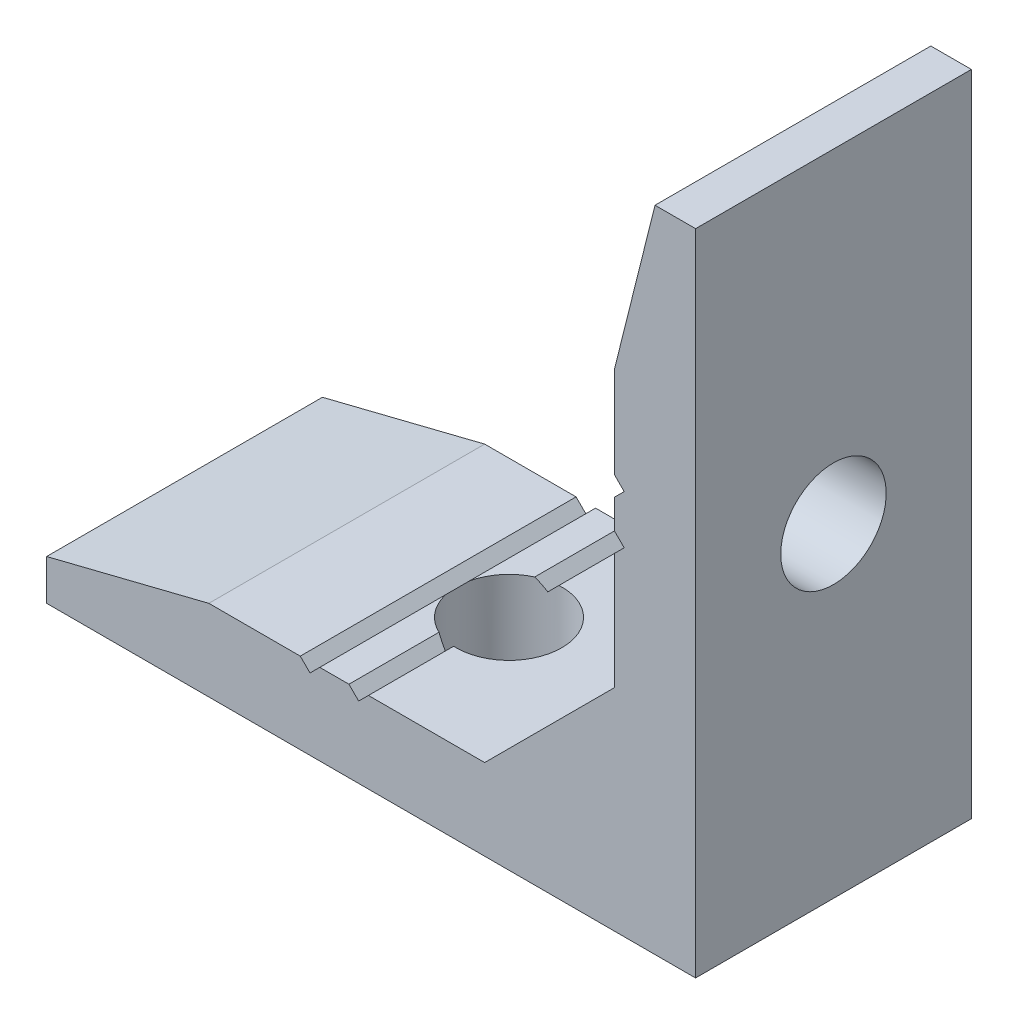
ISO-10303-21;
HEADER;
FILE_DESCRIPTION(('STEP AP214'),'2;1');
FILE_NAME('part.step','',(''),(''),'','','');
FILE_SCHEMA(('AUTOMOTIVE_DESIGN { 1 0 10303 214 1 1 1 1 }'));
ENDSEC;
DATA;
#1=APPLICATION_CONTEXT('core data for automotive mechanical design processes');
#2=APPLICATION_PROTOCOL_DEFINITION('international standard','automotive_design',2000,#1);
#3=PRODUCT_CONTEXT('',#1,'mechanical');
#4=PRODUCT('Part','Part','',(#3));
#5=PRODUCT_RELATED_PRODUCT_CATEGORY('part','',(#4));
#6=PRODUCT_DEFINITION_FORMATION('','',#4);
#7=PRODUCT_DEFINITION_CONTEXT('part definition',#1,'design');
#8=PRODUCT_DEFINITION('design','',#6,#7);
#9=PRODUCT_DEFINITION_SHAPE('','',#8);
#10=(LENGTH_UNIT() NAMED_UNIT(*) SI_UNIT(.MILLI.,.METRE.));
#11=(NAMED_UNIT(*) PLANE_ANGLE_UNIT() SI_UNIT($,.RADIAN.));
#12=(NAMED_UNIT(*) SI_UNIT($,.STERADIAN.) SOLID_ANGLE_UNIT());
#13=UNCERTAINTY_MEASURE_WITH_UNIT(LENGTH_MEASURE(1.E-05),#10,'distance_accuracy_value','');
#14=(GEOMETRIC_REPRESENTATION_CONTEXT(3) GLOBAL_UNCERTAINTY_ASSIGNED_CONTEXT((#13)) GLOBAL_UNIT_ASSIGNED_CONTEXT((#10,
#11,#12)) REPRESENTATION_CONTEXT('',''));
#15=CARTESIAN_POINT('',(0.,0.,0.));
#16=DIRECTION('',(0.,0.,1.));
#17=DIRECTION('',(1.,0.,0.));
#18=AXIS2_PLACEMENT_3D('',#15,#16,#17);
#19=CARTESIAN_POINT('',(34.9999999999998,21.3649508334714,8.5));
#20=DIRECTION('',(1.,-1.27213054904832E-13,0.));
#21=DIRECTION('',(1.27213054904832E-13,1.,0.));
#22=AXIS2_PLACEMENT_3D('',#19,#20,#21);
#23=PLANE('',#22);
#24=DIRECTION('',(0.,0.,-1.));
#25=VECTOR('',#24,1.);
#26=CARTESIAN_POINT('',(35.,23.1649508334733,8.5));
#27=LINE('',#26,#25);
#28=CARTESIAN_POINT('',(35.,23.1649508334733,8.5));
#29=VERTEX_POINT('',#28);
#30=CARTESIAN_POINT('',(35.,23.1649508334733,0.738638085733853));
#31=VERTEX_POINT('',#30);
#32=EDGE_CURVE('E257',#29,#31,#27,.T.);
#33=ORIENTED_EDGE('',*,*,#32,.T.);
#34=CARTESIAN_POINT('',(35.,20.,0.));
#35=DIRECTION('',(-1.,0.,0.));
#36=DIRECTION('',(0.,0.,1.));
#37=AXIS2_PLACEMENT_3D('',#34,#35,#36);
#38=CIRCLE('',#37,3.25);
#39=CARTESIAN_POINT('',(35.,21.3649508334712,2.94947609283518));
#40=VERTEX_POINT('',#39);
#41=EDGE_CURVE('E507',#40,#31,#38,.T.);
#42=ORIENTED_EDGE('',*,*,#41,.F.);
#43=DIRECTION('',(0.,0.,-1.));
#44=VECTOR('',#43,1.);
#45=CARTESIAN_POINT('',(34.9999999999998,21.3649508334714,8.5));
#46=LINE('',#45,#44);
#47=CARTESIAN_POINT('',(34.9999999999998,21.3649508334714,8.5));
#48=VERTEX_POINT('',#47);
#49=EDGE_CURVE('E253',#48,#40,#46,.T.);
#50=ORIENTED_EDGE('',*,*,#49,.F.);
#51=DIRECTION('',(-1.27213054904832E-13,-1.,0.));
#52=VECTOR('',#51,1.);
#53=CARTESIAN_POINT('',(34.9999999999998,21.3649508334714,8.5));
#54=LINE('',#53,#52);
#55=EDGE_CURVE('E406',#29,#48,#54,.T.);
#56=ORIENTED_EDGE('',*,*,#55,.F.);
#57=EDGE_LOOP('',(#33,#42,#50,#56));
#58=FACE_BOUND('',#57,.T.);
#59=ADVANCED_FACE('F35',(#58),#23,.F.);
#60=CARTESIAN_POINT('',(35.5999999999993,20.7649508334723,8.5));
#61=DIRECTION('',(0.707106781186345,0.70710678118675,0.));
#62=DIRECTION('',(-0.70710678118675,0.707106781186345,0.));
#63=AXIS2_PLACEMENT_3D('',#60,#61,#62);
#64=PLANE('',#63);
#65=ORIENTED_EDGE('',*,*,#49,.T.);
#66=CARTESIAN_POINT('',(36.364950833472,20.,0.));
#67=DIRECTION('',(0.707106781186345,0.70710678118675,0.));
#68=DIRECTION('',(-0.70710678118675,0.707106781186345,0.));
#69=AXIS2_PLACEMENT_3D('',#66,#67,#68);
#70=ELLIPSE('',#69,4.59619407771387,3.25);
#71=CARTESIAN_POINT('',(35.5999999999993,20.7649508334723,3.15869438571857));
#72=VERTEX_POINT('',#71);
#73=EDGE_CURVE('E238',#40,#72,#70,.T.);
#74=ORIENTED_EDGE('',*,*,#73,.T.);
#75=DIRECTION('',(0.,0.,-1.));
#76=VECTOR('',#75,1.);
#77=CARTESIAN_POINT('',(35.5999999999993,20.7649508334723,8.5));
#78=LINE('',#77,#76);
#79=CARTESIAN_POINT('',(35.5999999999993,20.7649508334723,8.5));
#80=VERTEX_POINT('',#79);
#81=EDGE_CURVE('E237',#80,#72,#78,.T.);
#82=ORIENTED_EDGE('',*,*,#81,.F.);
#83=DIRECTION('',(0.70710678118675,-0.707106781186345,0.));
#84=VECTOR('',#83,1.);
#85=CARTESIAN_POINT('',(35.5999999999993,20.7649508334723,8.5));
#86=LINE('',#85,#84);
#87=EDGE_CURVE('E408',#48,#80,#86,.T.);
#88=ORIENTED_EDGE('',*,*,#87,.F.);
#89=EDGE_LOOP('',(#65,#74,#82,#88));
#90=FACE_BOUND('',#89,.T.);
#91=ADVANCED_FACE('F509',(#90),#64,.F.);
#92=CARTESIAN_POINT('',(35.5999999999993,20.7649508334723,8.5));
#93=DIRECTION('',(0.707106781186615,-0.70710678118648,0.));
#94=DIRECTION('',(0.70710678118648,0.707106781186615,0.));
#95=AXIS2_PLACEMENT_3D('',#92,#93,#94);
#96=PLANE('',#95);
#97=DIRECTION('',(0.,0.,-1.));
#98=VECTOR('',#97,1.);
#99=CARTESIAN_POINT('',(35.,20.164950833473,8.5));
#100=LINE('',#99,#98);
#101=CARTESIAN_POINT('',(35.,20.164950833473,-3.24581133501881));
#102=VERTEX_POINT('',#101);
#103=CARTESIAN_POINT('',(35.,20.164950833473,-8.5));
#104=VERTEX_POINT('',#103);
#105=EDGE_CURVE('E245',#102,#104,#100,.T.);
#106=ORIENTED_EDGE('',*,*,#105,.F.);
#107=CARTESIAN_POINT('',(34.8350491665271,20.,0.));
#108=DIRECTION('',(0.707106781186615,-0.70710678118648,0.));
#109=DIRECTION('',(-0.70710678118648,-0.707106781186615,0.));
#110=AXIS2_PLACEMENT_3D('',#107,#108,#109);
#111=ELLIPSE('',#110,4.59619407771212,3.25);
#112=CARTESIAN_POINT('',(35.5999999999993,20.7649508334723,-3.15869438571857));
#113=VERTEX_POINT('',#112);
#114=EDGE_CURVE('E50',#102,#113,#111,.T.);
#115=ORIENTED_EDGE('',*,*,#114,.T.);
#116=CARTESIAN_POINT('',(35.5999999999993,20.7649508334723,-8.5));
#117=VERTEX_POINT('',#116);
#118=EDGE_CURVE('E244',#113,#117,#78,.T.);
#119=ORIENTED_EDGE('',*,*,#118,.T.);
#120=DIRECTION('',(-0.70710678118648,-0.707106781186615,0.));
#121=VECTOR('',#120,1.);
#122=CARTESIAN_POINT('',(35.5999999999993,20.7649508334723,-8.5));
#123=LINE('',#122,#121);
#124=EDGE_CURVE('E339',#117,#104,#123,.T.);
#125=ORIENTED_EDGE('',*,*,#124,.T.);
#126=EDGE_LOOP('',(#106,#115,#119,#125));
#127=FACE_BOUND('',#126,.T.);
#128=ADVANCED_FACE('F452',(#127),#96,.F.);
#129=CARTESIAN_POINT('',(19.2350491665275,4.39999999999998,8.5));
#130=DIRECTION('',(0.707106781186479,-0.707106781186616,0.));
#131=DIRECTION('',(0.707106781186616,0.707106781186479,0.));
#132=AXIS2_PLACEMENT_3D('',#129,#130,#131);
#133=PLANE('',#132);
#134=DIRECTION('',(0.,0.,-1.));
#135=VECTOR('',#134,1.);
#136=CARTESIAN_POINT('',(19.8350491665276,5.,8.5));
#137=LINE('',#136,#135);
#138=CARTESIAN_POINT('',(19.8350491665276,5.,8.5));
#139=VERTEX_POINT('',#138);
#140=CARTESIAN_POINT('',(19.8350491665276,5.,3.24581133501884));
#141=VERTEX_POINT('',#140);
#142=EDGE_CURVE('E312',#139,#141,#137,.T.);
#143=ORIENTED_EDGE('',*,*,#142,.T.);
#144=CARTESIAN_POINT('',(20.,5.16495083347237,0.));
#145=DIRECTION('',(0.707106781186479,-0.707106781186616,0.));
#146=DIRECTION('',(0.707106781186616,0.707106781186479,0.));
#147=AXIS2_PLACEMENT_3D('',#144,#145,#146);
#148=ELLIPSE('',#147,4.59619407771211,3.25);
#149=CARTESIAN_POINT('',(19.2350491665275,4.39999999999998,3.15869438571851));
#150=VERTEX_POINT('',#149);
#151=EDGE_CURVE('E392',#141,#150,#148,.T.);
#152=ORIENTED_EDGE('',*,*,#151,.T.);
#153=DIRECTION('',(0.,0.,-1.));
#154=VECTOR('',#153,1.);
#155=CARTESIAN_POINT('',(19.2350491665275,4.39999999999998,8.5));
#156=LINE('',#155,#154);
#157=CARTESIAN_POINT('',(19.2350491665275,4.39999999999998,8.5));
#158=VERTEX_POINT('',#157);
#159=EDGE_CURVE('E308',#158,#150,#156,.T.);
#160=ORIENTED_EDGE('',*,*,#159,.F.);
#161=DIRECTION('',(-0.707106781186616,-0.707106781186479,0.));
#162=VECTOR('',#161,1.);
#163=CARTESIAN_POINT('',(19.2350491665275,4.39999999999998,8.5));
#164=LINE('',#163,#162);
#165=EDGE_CURVE('E416',#139,#158,#164,.T.);
#166=ORIENTED_EDGE('',*,*,#165,.F.);
#167=EDGE_LOOP('',(#143,#152,#160,#166));
#168=FACE_BOUND('',#167,.T.);
#169=ADVANCED_FACE('F519',(#168),#133,.F.);
#170=CARTESIAN_POINT('',(19.2350491665275,4.39999999999998,8.5));
#171=DIRECTION('',(-0.707106781186481,-0.707106781186614,0.));
#172=DIRECTION('',(0.707106781186614,-0.707106781186481,0.));
#173=AXIS2_PLACEMENT_3D('',#170,#171,#172);
#174=PLANE('',#173);
#175=DIRECTION('',(0.,0.,-1.));
#176=VECTOR('',#175,1.);
#177=CARTESIAN_POINT('',(18.6350491665274,5.,8.5));
#178=LINE('',#177,#176);
#179=CARTESIAN_POINT('',(18.6350491665274,5.,-2.9494760928345));
#180=VERTEX_POINT('',#179);
#181=CARTESIAN_POINT('',(18.6350491665274,5.,-8.5));
#182=VERTEX_POINT('',#181);
#183=EDGE_CURVE('E298',#180,#182,#178,.T.);
#184=ORIENTED_EDGE('',*,*,#183,.F.);
#185=CARTESIAN_POINT('',(20.,3.63504916652758,0.));
#186=DIRECTION('',(-0.707106781186481,-0.707106781186614,0.));
#187=DIRECTION('',(-0.707106781186614,0.707106781186481,0.));
#188=AXIS2_PLACEMENT_3D('',#185,#186,#187);
#189=ELLIPSE('',#188,4.59619407771213,3.25);
#190=CARTESIAN_POINT('',(19.2350491665275,4.39999999999998,-3.15869438571851));
#191=VERTEX_POINT('',#190);
#192=EDGE_CURVE('E575',#180,#191,#189,.T.);
#193=ORIENTED_EDGE('',*,*,#192,.T.);
#194=CARTESIAN_POINT('',(19.2350491665275,4.39999999999998,-8.5));
#195=VERTEX_POINT('',#194);
#196=EDGE_CURVE('E307',#191,#195,#156,.T.);
#197=ORIENTED_EDGE('',*,*,#196,.T.);
#198=DIRECTION('',(-0.707106781186614,0.707106781186481,0.));
#199=VECTOR('',#198,1.);
#200=CARTESIAN_POINT('',(19.2350491665275,4.39999999999998,-8.5));
#201=LINE('',#200,#199);
#202=EDGE_CURVE('E345',#195,#182,#201,.T.);
#203=ORIENTED_EDGE('',*,*,#202,.T.);
#204=EDGE_LOOP('',(#184,#193,#197,#203));
#205=FACE_BOUND('',#204,.T.);
#206=ADVANCED_FACE('F711',(#205),#174,.F.);
#207=CARTESIAN_POINT('',(16.8350491665274,5.,8.5));
#208=DIRECTION('',(0.,-1.,0.));
#209=DIRECTION('',(0.,0.,-1.));
#210=AXIS2_PLACEMENT_3D('',#207,#208,#209);
#211=PLANE('',#210);
#212=CARTESIAN_POINT('',(18.6350491665274,5.,8.5));
#213=VERTEX_POINT('',#212);
#214=CARTESIAN_POINT('',(18.6350491665274,5.,2.9494760928345));
#215=VERTEX_POINT('',#214);
#216=EDGE_CURVE('E304',#213,#215,#178,.T.);
#217=ORIENTED_EDGE('',*,*,#216,.T.);
#218=CARTESIAN_POINT('',(20.,5.,0.));
#219=DIRECTION('',(0.,1.,0.));
#220=DIRECTION('',(0.,0.,1.));
#221=AXIS2_PLACEMENT_3D('',#218,#219,#220);
#222=CIRCLE('',#221,3.25);
#223=CARTESIAN_POINT('',(16.8350491665274,5.,0.738638085736784));
#224=VERTEX_POINT('',#223);
#225=EDGE_CURVE('E529',#224,#215,#222,.T.);
#226=ORIENTED_EDGE('',*,*,#225,.F.);
#227=DIRECTION('',(0.,0.,-1.));
#228=VECTOR('',#227,1.);
#229=CARTESIAN_POINT('',(16.8350491665274,5.,8.5));
#230=LINE('',#229,#228);
#231=CARTESIAN_POINT('',(16.8350491665274,5.,8.5));
#232=VERTEX_POINT('',#231);
#233=EDGE_CURVE('E288',#232,#224,#230,.T.);
#234=ORIENTED_EDGE('',*,*,#233,.F.);
#235=DIRECTION('',(-1.,0.,0.));
#236=VECTOR('',#235,1.);
#237=CARTESIAN_POINT('',(16.8350491665274,5.,8.5));
#238=LINE('',#237,#236);
#239=EDGE_CURVE('E420',#213,#232,#238,.T.);
#240=ORIENTED_EDGE('',*,*,#239,.F.);
#241=EDGE_LOOP('',(#217,#226,#234,#240));
#242=FACE_BOUND('',#241,.T.);
#243=ADVANCED_FACE('F528',(#242),#211,.F.);
#244=CARTESIAN_POINT('',(0.,2.5,8.5));
#245=DIRECTION('',(1.,0.,0.));
#246=DIRECTION('',(0.,0.,-1.));
#247=AXIS2_PLACEMENT_3D('',#244,#245,#246);
#248=PLANE('',#247);
#249=DIRECTION('',(0.,-1.,0.));
#250=VECTOR('',#249,1.);
#251=CARTESIAN_POINT('',(0.,2.5,-8.5));
#252=LINE('',#251,#250);
#253=CARTESIAN_POINT('',(0.,2.5,-8.5));
#254=VERTEX_POINT('',#253);
#255=CARTESIAN_POINT('',(0.,0.,-8.5));
#256=VERTEX_POINT('',#255);
#257=EDGE_CURVE('E377',#254,#256,#252,.T.);
#258=ORIENTED_EDGE('',*,*,#257,.T.);
#259=DIRECTION('',(0.,0.,-1.));
#260=VECTOR('',#259,1.);
#261=CARTESIAN_POINT('',(0.,0.,8.5));
#262=LINE('',#261,#260);
#263=CARTESIAN_POINT('',(0.,0.,8.5));
#264=VERTEX_POINT('',#263);
#265=EDGE_CURVE('E278',#264,#256,#262,.T.);
#266=ORIENTED_EDGE('',*,*,#265,.F.);
#267=DIRECTION('',(0.,-1.,0.));
#268=VECTOR('',#267,1.);
#269=CARTESIAN_POINT('',(0.,2.5,8.5));
#270=LINE('',#269,#268);
#271=CARTESIAN_POINT('',(0.,2.5,8.5));
#272=VERTEX_POINT('',#271);
#273=EDGE_CURVE('E357',#272,#264,#270,.T.);
#274=ORIENTED_EDGE('',*,*,#273,.F.);
#275=DIRECTION('',(0.,0.,-1.));
#276=VECTOR('',#275,1.);
#277=CARTESIAN_POINT('',(0.,2.5,8.5));
#278=LINE('',#277,#276);
#279=EDGE_CURVE('E358',#272,#254,#278,.T.);
#280=ORIENTED_EDGE('',*,*,#279,.T.);
#281=EDGE_LOOP('',(#258,#266,#274,#280));
#282=FACE_BOUND('',#281,.T.);
#283=ADVANCED_FACE('F37',(#282),#248,.F.);
#284=CARTESIAN_POINT('',(0.,0.,8.5));
#285=DIRECTION('',(0.,1.,0.));
#286=DIRECTION('',(0.,0.,1.));
#287=AXIS2_PLACEMENT_3D('',#284,#285,#286);
#288=PLANE('',#287);
#289=CARTESIAN_POINT('',(20.,0.,0.));
#290=DIRECTION('',(0.,1.,0.));
#291=DIRECTION('',(0.,0.,1.));
#292=AXIS2_PLACEMENT_3D('',#289,#290,#291);
#293=CIRCLE('',#292,3.25);
#294=CARTESIAN_POINT('',(20.,0.,3.25));
#295=VERTEX_POINT('',#294);
#296=EDGE_CURVE('E572',#295,#295,#293,.T.);
#297=ORIENTED_EDGE('',*,*,#296,.T.);
#298=EDGE_LOOP('',(#297));
#299=FACE_BOUND('',#298,.T.);
#300=DIRECTION('',(1.,0.,0.));
#301=VECTOR('',#300,1.);
#302=CARTESIAN_POINT('',(0.,0.,-8.5));
#303=LINE('',#302,#301);
#304=CARTESIAN_POINT('',(40.,0.,-8.5));
#305=VERTEX_POINT('',#304);
#306=EDGE_CURVE('E429',#256,#305,#303,.T.);
#307=ORIENTED_EDGE('',*,*,#306,.T.);
#308=DIRECTION('',(0.,0.,-1.));
#309=VECTOR('',#308,1.);
#310=CARTESIAN_POINT('',(40.,0.,8.5));
#311=LINE('',#310,#309);
#312=CARTESIAN_POINT('',(40.,0.,8.5));
#313=VERTEX_POINT('',#312);
#314=EDGE_CURVE('E275',#313,#305,#311,.T.);
#315=ORIENTED_EDGE('',*,*,#314,.F.);
#316=DIRECTION('',(1.,0.,0.));
#317=VECTOR('',#316,1.);
#318=CARTESIAN_POINT('',(0.,0.,8.5));
#319=LINE('',#318,#317);
#320=EDGE_CURVE('E387',#264,#313,#319,.T.);
#321=ORIENTED_EDGE('',*,*,#320,.F.);
#322=ORIENTED_EDGE('',*,*,#265,.T.);
#323=EDGE_LOOP('',(#307,#315,#321,#322));
#324=FACE_BOUND('',#323,.T.);
#325=ADVANCED_FACE('F498',(#299,#324),#288,.F.);
#326=CARTESIAN_POINT('',(40.,0.,8.5));
#327=DIRECTION('',(-1.,0.,0.));
#328=DIRECTION('',(0.,0.,1.));
#329=AXIS2_PLACEMENT_3D('',#326,#327,#328);
#330=PLANE('',#329);
#331=CARTESIAN_POINT('',(40.,20.,0.));
#332=DIRECTION('',(-1.,0.,0.));
#333=DIRECTION('',(0.,0.,1.));
#334=AXIS2_PLACEMENT_3D('',#331,#332,#333);
#335=CIRCLE('',#334,3.25);
#336=CARTESIAN_POINT('',(40.,20.,3.25));
#337=VERTEX_POINT('',#336);
#338=EDGE_CURVE('E239',#337,#337,#335,.T.);
#339=ORIENTED_EDGE('',*,*,#338,.T.);
#340=EDGE_LOOP('',(#339));
#341=FACE_BOUND('',#340,.T.);
#342=DIRECTION('',(0.,1.,0.));
#343=VECTOR('',#342,1.);
#344=CARTESIAN_POINT('',(40.,0.,-8.5));
#345=LINE('',#344,#343);
#346=CARTESIAN_POINT('',(40.,40.,-8.5));
#347=VERTEX_POINT('',#346);
#348=EDGE_CURVE('E432',#305,#347,#345,.T.);
#349=ORIENTED_EDGE('',*,*,#348,.T.);
#350=DIRECTION('',(0.,0.,-1.));
#351=VECTOR('',#350,1.);
#352=CARTESIAN_POINT('',(40.,40.,8.5));
#353=LINE('',#352,#351);
#354=CARTESIAN_POINT('',(40.,40.,8.5));
#355=VERTEX_POINT('',#354);
#356=EDGE_CURVE('E272',#355,#347,#353,.T.);
#357=ORIENTED_EDGE('',*,*,#356,.F.);
#358=DIRECTION('',(0.,1.,0.));
#359=VECTOR('',#358,1.);
#360=CARTESIAN_POINT('',(40.,0.,8.5));
#361=LINE('',#360,#359);
#362=EDGE_CURVE('E389',#313,#355,#361,.T.);
#363=ORIENTED_EDGE('',*,*,#362,.F.);
#364=ORIENTED_EDGE('',*,*,#314,.T.);
#365=EDGE_LOOP('',(#349,#357,#363,#364));
#366=FACE_BOUND('',#365,.T.);
#367=ADVANCED_FACE('F495',(#341,#366),#330,.F.);
#368=CARTESIAN_POINT('',(37.5,40.,8.5));
#369=DIRECTION('',(0.,-1.,0.));
#370=DIRECTION('',(0.,0.,-1.));
#371=AXIS2_PLACEMENT_3D('',#368,#369,#370);
#372=PLANE('',#371);
#373=DIRECTION('',(-1.,0.,0.));
#374=VECTOR('',#373,1.);
#375=CARTESIAN_POINT('',(37.5,40.,-8.5));
#376=LINE('',#375,#374);
#377=CARTESIAN_POINT('',(37.5,40.,-8.5));
#378=VERTEX_POINT('',#377);
#379=EDGE_CURVE('E434',#347,#378,#376,.T.);
#380=ORIENTED_EDGE('',*,*,#379,.T.);
#381=DIRECTION('',(0.,0.,-1.));
#382=VECTOR('',#381,1.);
#383=CARTESIAN_POINT('',(37.5,40.,8.5));
#384=LINE('',#383,#382);
#385=CARTESIAN_POINT('',(37.5,40.,8.5));
#386=VERTEX_POINT('',#385);
#387=EDGE_CURVE('E269',#386,#378,#384,.T.);
#388=ORIENTED_EDGE('',*,*,#387,.F.);
#389=DIRECTION('',(-1.,0.,0.));
#390=VECTOR('',#389,1.);
#391=CARTESIAN_POINT('',(37.5,40.,8.5));
#392=LINE('',#391,#390);
#393=EDGE_CURVE('E396',#355,#386,#392,.T.);
#394=ORIENTED_EDGE('',*,*,#393,.F.);
#395=ORIENTED_EDGE('',*,*,#356,.T.);
#396=EDGE_LOOP('',(#380,#388,#394,#395));
#397=FACE_BOUND('',#396,.T.);
#398=ADVANCED_FACE('F490',(#397),#372,.F.);
#399=CARTESIAN_POINT('',(37.5,40.,8.5));
#400=DIRECTION('',(0.970142500145332,-0.242535625036333,0.));
#401=DIRECTION('',(0.242535625036332,0.970142500145332,0.));
#402=AXIS2_PLACEMENT_3D('',#399,#400,#401);
#403=PLANE('',#402);
#404=DIRECTION('',(-0.242535625036332,-0.970142500145332,0.));
#405=VECTOR('',#404,1.);
#406=CARTESIAN_POINT('',(37.5,40.,-8.5));
#407=LINE('',#406,#405);
#408=CARTESIAN_POINT('',(35.,30.,-8.5));
#409=VERTEX_POINT('',#408);
#410=EDGE_CURVE('E436',#378,#409,#407,.T.);
#411=ORIENTED_EDGE('',*,*,#410,.T.);
#412=DIRECTION('',(0.,0.,-1.));
#413=VECTOR('',#412,1.);
#414=CARTESIAN_POINT('',(35.,30.,8.5));
#415=LINE('',#414,#413);
#416=CARTESIAN_POINT('',(35.,30.,8.5));
#417=VERTEX_POINT('',#416);
#418=EDGE_CURVE('E266',#417,#409,#415,.T.);
#419=ORIENTED_EDGE('',*,*,#418,.F.);
#420=DIRECTION('',(-0.242535625036332,-0.970142500145332,0.));
#421=VECTOR('',#420,1.);
#422=CARTESIAN_POINT('',(37.5,40.,8.5));
#423=LINE('',#422,#421);
#424=EDGE_CURVE('E398',#386,#417,#423,.T.);
#425=ORIENTED_EDGE('',*,*,#424,.F.);
#426=ORIENTED_EDGE('',*,*,#387,.T.);
#427=EDGE_LOOP('',(#411,#419,#425,#426));
#428=FACE_BOUND('',#427,.T.);
#429=ADVANCED_FACE('F485',(#428),#403,.F.);
#430=CARTESIAN_POINT('',(35.,24.3649508334714,8.5));
#431=DIRECTION('',(1.,0.,0.));
#432=DIRECTION('',(0.,0.,-1.));
#433=AXIS2_PLACEMENT_3D('',#430,#431,#432);
#434=PLANE('',#433);
#435=DIRECTION('',(0.,-1.,0.));
#436=VECTOR('',#435,1.);
#437=CARTESIAN_POINT('',(35.,24.3649508334714,-8.5));
#438=LINE('',#437,#436);
#439=CARTESIAN_POINT('',(35.,24.3649508334714,-8.5));
#440=VERTEX_POINT('',#439);
#441=EDGE_CURVE('E438',#409,#440,#438,.T.);
#442=ORIENTED_EDGE('',*,*,#441,.T.);
#443=DIRECTION('',(0.,0.,-1.));
#444=VECTOR('',#443,1.);
#445=CARTESIAN_POINT('',(35.,24.3649508334714,8.5));
#446=LINE('',#445,#444);
#447=CARTESIAN_POINT('',(35.,24.3649508334714,8.5));
#448=VERTEX_POINT('',#447);
#449=EDGE_CURVE('E263',#448,#440,#446,.T.);
#450=ORIENTED_EDGE('',*,*,#449,.F.);
#451=DIRECTION('',(0.,-1.,0.));
#452=VECTOR('',#451,1.);
#453=CARTESIAN_POINT('',(35.,24.3649508334714,8.5));
#454=LINE('',#453,#452);
#455=EDGE_CURVE('E400',#417,#448,#454,.T.);
#456=ORIENTED_EDGE('',*,*,#455,.F.);
#457=ORIENTED_EDGE('',*,*,#418,.T.);
#458=EDGE_LOOP('',(#442,#450,#456,#457));
#459=FACE_BOUND('',#458,.T.);
#460=ADVANCED_FACE('F481',(#459),#434,.F.);
#461=CARTESIAN_POINT('',(35.599999999999,23.7649508334723,8.5));
#462=DIRECTION('',(0.707106781186617,0.707106781186478,0.));
#463=DIRECTION('',(-0.707106781186478,0.707106781186617,0.));
#464=AXIS2_PLACEMENT_3D('',#461,#462,#463);
#465=PLANE('',#464);
#466=DIRECTION('',(0.707106781186478,-0.707106781186617,0.));
#467=VECTOR('',#466,1.);
#468=CARTESIAN_POINT('',(35.599999999999,23.7649508334723,-8.5));
#469=LINE('',#468,#467);
#470=CARTESIAN_POINT('',(35.599999999999,23.7649508334723,-8.5));
#471=VERTEX_POINT('',#470);
#472=EDGE_CURVE('E440',#440,#471,#469,.T.);
#473=ORIENTED_EDGE('',*,*,#472,.T.);
#474=DIRECTION('',(0.,0.,-1.));
#475=VECTOR('',#474,1.);
#476=CARTESIAN_POINT('',(35.599999999999,23.7649508334723,8.5));
#477=LINE('',#476,#475);
#478=CARTESIAN_POINT('',(35.599999999999,23.7649508334723,8.5));
#479=VERTEX_POINT('',#478);
#480=EDGE_CURVE('E260',#479,#471,#477,.T.);
#481=ORIENTED_EDGE('',*,*,#480,.F.);
#482=DIRECTION('',(0.707106781186478,-0.707106781186617,0.));
#483=VECTOR('',#482,1.);
#484=CARTESIAN_POINT('',(35.599999999999,23.7649508334723,8.5));
#485=LINE('',#484,#483);
#486=EDGE_CURVE('E402',#448,#479,#485,.T.);
#487=ORIENTED_EDGE('',*,*,#486,.F.);
#488=ORIENTED_EDGE('',*,*,#449,.T.);
#489=EDGE_LOOP('',(#473,#481,#487,#488));
#490=FACE_BOUND('',#489,.T.);
#491=ADVANCED_FACE('F476',(#490),#465,.F.);
#492=CARTESIAN_POINT('',(35.599999999999,23.7649508334723,8.5));
#493=DIRECTION('',(0.707106781186547,-0.707106781186547,0.));
#494=DIRECTION('',(0.707106781186548,0.707106781186548,0.));
#495=AXIS2_PLACEMENT_3D('',#492,#493,#494);
#496=PLANE('',#495);
#497=CARTESIAN_POINT('',(35.,23.1649508334733,-0.738638085733853));
#498=VERTEX_POINT('',#497);
#499=CARTESIAN_POINT('',(35.,23.1649508334733,-8.5));
#500=VERTEX_POINT('',#499);
#501=EDGE_CURVE('E256',#498,#500,#27,.T.);
#502=ORIENTED_EDGE('',*,*,#501,.F.);
#503=CARTESIAN_POINT('',(31.8350491665267,20.,0.));
#504=DIRECTION('',(0.707106781186547,-0.707106781186547,0.));
#505=DIRECTION('',(-0.707106781186548,-0.707106781186548,0.));
#506=AXIS2_PLACEMENT_3D('',#503,#504,#505);
#507=ELLIPSE('',#506,4.59619407771256,3.25);
#508=EDGE_CURVE('E503',#498,#31,#507,.T.);
#509=ORIENTED_EDGE('',*,*,#508,.T.);
#510=ORIENTED_EDGE('',*,*,#32,.F.);
#511=DIRECTION('',(-0.707106781186548,-0.707106781186548,0.));
#512=VECTOR('',#511,1.);
#513=CARTESIAN_POINT('',(35.599999999999,23.7649508334723,8.5));
#514=LINE('',#513,#512);
#515=EDGE_CURVE('E404',#479,#29,#514,.T.);
#516=ORIENTED_EDGE('',*,*,#515,.F.);
#517=ORIENTED_EDGE('',*,*,#480,.T.);
#518=DIRECTION('',(-0.707106781186548,-0.707106781186548,0.));
#519=VECTOR('',#518,1.);
#520=CARTESIAN_POINT('',(35.599999999999,23.7649508334723,-8.5));
#521=LINE('',#520,#519);
#522=EDGE_CURVE('E442',#471,#500,#521,.T.);
#523=ORIENTED_EDGE('',*,*,#522,.T.);
#524=EDGE_LOOP('',(#502,#509,#510,#516,#517,#523));
#525=FACE_BOUND('',#524,.T.);
#526=ADVANCED_FACE('F469',(#525),#496,.F.);
#527=CARTESIAN_POINT('',(35.,21.3649508334712,-2.94947609283518));
#528=VERTEX_POINT('',#527);
#529=CARTESIAN_POINT('',(34.9999999999998,21.3649508334714,-8.5));
#530=VERTEX_POINT('',#529);
#531=EDGE_CURVE('E252',#528,#530,#46,.T.);
#532=ORIENTED_EDGE('',*,*,#531,.F.);
#533=EDGE_CURVE('E466',#498,#528,#38,.T.);
#534=ORIENTED_EDGE('',*,*,#533,.F.);
#535=ORIENTED_EDGE('',*,*,#501,.T.);
#536=DIRECTION('',(-1.27213054904832E-13,-1.,0.));
#537=VECTOR('',#536,1.);
#538=CARTESIAN_POINT('',(34.9999999999998,21.3649508334714,-8.5));
#539=LINE('',#538,#537);
#540=EDGE_CURVE('E445',#500,#530,#539,.T.);
#541=ORIENTED_EDGE('',*,*,#540,.T.);
#542=EDGE_LOOP('',(#532,#534,#535,#541));
#543=FACE_BOUND('',#542,.T.);
#544=ADVANCED_FACE('F464',(#543),#23,.F.);
#545=ORIENTED_EDGE('',*,*,#118,.F.);
#546=EDGE_CURVE('E461',#113,#528,#70,.T.);
#547=ORIENTED_EDGE('',*,*,#546,.T.);
#548=ORIENTED_EDGE('',*,*,#531,.T.);
#549=DIRECTION('',(0.70710678118675,-0.707106781186345,0.));
#550=VECTOR('',#549,1.);
#551=CARTESIAN_POINT('',(35.5999999999993,20.7649508334723,-8.5));
#552=LINE('',#551,#550);
#553=EDGE_CURVE('E448',#530,#117,#552,.T.);
#554=ORIENTED_EDGE('',*,*,#553,.T.);
#555=EDGE_LOOP('',(#545,#547,#548,#554));
#556=FACE_BOUND('',#555,.T.);
#557=ADVANCED_FACE('F458',(#556),#64,.F.);
#558=ORIENTED_EDGE('',*,*,#81,.T.);
#559=CARTESIAN_POINT('',(35.,20.164950833473,3.24581133501881));
#560=VERTEX_POINT('',#559);
#561=EDGE_CURVE('E224',#72,#560,#111,.T.);
#562=ORIENTED_EDGE('',*,*,#561,.T.);
#563=CARTESIAN_POINT('',(35.,20.164950833473,8.5));
#564=VERTEX_POINT('',#563);
#565=EDGE_CURVE('E234',#564,#560,#100,.T.);
#566=ORIENTED_EDGE('',*,*,#565,.F.);
#567=DIRECTION('',(-0.70710678118648,-0.707106781186615,0.));
#568=VECTOR('',#567,1.);
#569=CARTESIAN_POINT('',(35.5999999999993,20.7649508334723,8.5));
#570=LINE('',#569,#568);
#571=EDGE_CURVE('E410',#80,#564,#570,.T.);
#572=ORIENTED_EDGE('',*,*,#571,.F.);
#573=EDGE_LOOP('',(#558,#562,#566,#572));
#574=FACE_BOUND('',#573,.T.);
#575=ADVANCED_FACE('F232',(#574),#96,.F.);
#576=CARTESIAN_POINT('',(34.9999999999998,12.9999999999999,8.5));
#577=DIRECTION('',(1.,0.,0.));
#578=DIRECTION('',(0.,1.,0.));
#579=AXIS2_PLACEMENT_3D('',#576,#577,#578);
#580=PLANE('',#579);
#581=ORIENTED_EDGE('',*,*,#565,.T.);
#582=CARTESIAN_POINT('',(35.,20.,0.));
#583=DIRECTION('',(1.,0.,0.));
#584=DIRECTION('',(0.,1.,0.));
#585=AXIS2_PLACEMENT_3D('',#582,#583,#584);
#586=CIRCLE('',#585,3.25);
#587=EDGE_CURVE('E11',#560,#102,#586,.T.);
#588=ORIENTED_EDGE('',*,*,#587,.T.);
#589=ORIENTED_EDGE('',*,*,#105,.T.);
#590=DIRECTION('',(0.,-1.,0.));
#591=VECTOR('',#590,1.);
#592=CARTESIAN_POINT('',(34.9999999999998,12.9999999999999,-8.5));
#593=LINE('',#592,#591);
#594=CARTESIAN_POINT('',(34.9999999999998,12.9999999999999,-8.5));
#595=VERTEX_POINT('',#594);
#596=EDGE_CURVE('E333',#104,#595,#593,.T.);
#597=ORIENTED_EDGE('',*,*,#596,.T.);
#598=DIRECTION('',(0.,0.,-1.));
#599=VECTOR('',#598,1.);
#600=CARTESIAN_POINT('',(34.9999999999998,12.9999999999999,8.5));
#601=LINE('',#600,#599);
#602=CARTESIAN_POINT('',(34.9999999999998,12.9999999999999,8.5));
#603=VERTEX_POINT('',#602);
#604=EDGE_CURVE('E248',#603,#595,#601,.T.);
#605=ORIENTED_EDGE('',*,*,#604,.F.);
#606=DIRECTION('',(0.,-1.,0.));
#607=VECTOR('',#606,1.);
#608=CARTESIAN_POINT('',(34.9999999999998,12.9999999999999,8.5));
#609=LINE('',#608,#607);
#610=EDGE_CURVE('E243',#564,#603,#609,.T.);
#611=ORIENTED_EDGE('',*,*,#610,.F.);
#612=EDGE_LOOP('',(#581,#588,#589,#597,#605,#611));
#613=FACE_BOUND('',#612,.T.);
#614=ADVANCED_FACE('F241',(#613),#580,.F.);
#615=CARTESIAN_POINT('',(27.,5.,8.5));
#616=DIRECTION('',(0.707106781186552,-0.707106781186543,0.));
#617=DIRECTION('',(0.707106781186543,0.707106781186552,0.));
#618=AXIS2_PLACEMENT_3D('',#615,#616,#617);
#619=PLANE('',#618);
#620=DIRECTION('',(-0.707106781186543,-0.707106781186552,0.));
#621=VECTOR('',#620,1.);
#622=CARTESIAN_POINT('',(27.,5.,-8.5));
#623=LINE('',#622,#621);
#624=CARTESIAN_POINT('',(27.,5.,-8.5));
#625=VERTEX_POINT('',#624);
#626=EDGE_CURVE('E326',#595,#625,#623,.T.);
#627=ORIENTED_EDGE('',*,*,#626,.T.);
#628=DIRECTION('',(0.,0.,-1.));
#629=VECTOR('',#628,1.);
#630=CARTESIAN_POINT('',(27.,5.,8.5));
#631=LINE('',#630,#629);
#632=CARTESIAN_POINT('',(27.,5.,8.5));
#633=VERTEX_POINT('',#632);
#634=EDGE_CURVE('E314',#633,#625,#631,.T.);
#635=ORIENTED_EDGE('',*,*,#634,.F.);
#636=DIRECTION('',(-0.707106781186543,-0.707106781186552,0.));
#637=VECTOR('',#636,1.);
#638=CARTESIAN_POINT('',(27.,5.,8.5));
#639=LINE('',#638,#637);
#640=EDGE_CURVE('E327',#603,#633,#639,.T.);
#641=ORIENTED_EDGE('',*,*,#640,.F.);
#642=ORIENTED_EDGE('',*,*,#604,.T.);
#643=EDGE_LOOP('',(#627,#635,#641,#642));
#644=FACE_BOUND('',#643,.T.);
#645=ADVANCED_FACE('F325',(#644),#619,.F.);
#646=CARTESIAN_POINT('',(19.8350491665276,5.,8.5));
#647=DIRECTION('',(0.,-1.,0.));
#648=DIRECTION('',(0.,0.,-1.));
#649=AXIS2_PLACEMENT_3D('',#646,#647,#648);
#650=PLANE('',#649);
#651=CARTESIAN_POINT('',(19.8350491665276,5.,-3.24581133501884));
#652=VERTEX_POINT('',#651);
#653=CARTESIAN_POINT('',(19.8350491665276,5.,-8.5));
#654=VERTEX_POINT('',#653);
#655=EDGE_CURVE('E311',#652,#654,#137,.T.);
#656=ORIENTED_EDGE('',*,*,#655,.F.);
#657=EDGE_CURVE('E515',#141,#652,#222,.T.);
#658=ORIENTED_EDGE('',*,*,#657,.F.);
#659=ORIENTED_EDGE('',*,*,#142,.F.);
#660=DIRECTION('',(-1.,0.,0.));
#661=VECTOR('',#660,1.);
#662=CARTESIAN_POINT('',(19.8350491665276,5.,8.5));
#663=LINE('',#662,#661);
#664=EDGE_CURVE('E414',#633,#139,#663,.T.);
#665=ORIENTED_EDGE('',*,*,#664,.F.);
#666=ORIENTED_EDGE('',*,*,#634,.T.);
#667=DIRECTION('',(-1.,0.,0.));
#668=VECTOR('',#667,1.);
#669=CARTESIAN_POINT('',(19.8350491665276,5.,-8.5));
#670=LINE('',#669,#668);
#671=EDGE_CURVE('E335',#625,#654,#670,.T.);
#672=ORIENTED_EDGE('',*,*,#671,.T.);
#673=EDGE_LOOP('',(#656,#658,#659,#665,#666,#672));
#674=FACE_BOUND('',#673,.T.);
#675=ADVANCED_FACE('F512',(#674),#650,.F.);
#676=ORIENTED_EDGE('',*,*,#196,.F.);
#677=EDGE_CURVE('E430',#191,#652,#148,.T.);
#678=ORIENTED_EDGE('',*,*,#677,.T.);
#679=ORIENTED_EDGE('',*,*,#655,.T.);
#680=DIRECTION('',(-0.707106781186616,-0.707106781186479,0.));
#681=VECTOR('',#680,1.);
#682=CARTESIAN_POINT('',(19.2350491665275,4.39999999999998,-8.5));
#683=LINE('',#682,#681);
#684=EDGE_CURVE('E337',#654,#195,#683,.T.);
#685=ORIENTED_EDGE('',*,*,#684,.T.);
#686=EDGE_LOOP('',(#676,#678,#679,#685));
#687=FACE_BOUND('',#686,.T.);
#688=ADVANCED_FACE('F696',(#687),#133,.F.);
#689=ORIENTED_EDGE('',*,*,#159,.T.);
#690=EDGE_CURVE('E526',#150,#215,#189,.T.);
#691=ORIENTED_EDGE('',*,*,#690,.T.);
#692=ORIENTED_EDGE('',*,*,#216,.F.);
#693=DIRECTION('',(-0.707106781186614,0.707106781186481,0.));
#694=VECTOR('',#693,1.);
#695=CARTESIAN_POINT('',(19.2350491665275,4.39999999999998,8.5));
#696=LINE('',#695,#694);
#697=EDGE_CURVE('E418',#158,#213,#696,.T.);
#698=ORIENTED_EDGE('',*,*,#697,.F.);
#699=EDGE_LOOP('',(#689,#691,#692,#698));
#700=FACE_BOUND('',#699,.T.);
#701=ADVANCED_FACE('F525',(#700),#174,.F.);
#702=CARTESIAN_POINT('',(16.8350491665274,5.,-0.738638085736784));
#703=VERTEX_POINT('',#702);
#704=CARTESIAN_POINT('',(16.8350491665274,5.,-8.5));
#705=VERTEX_POINT('',#704);
#706=EDGE_CURVE('E284',#703,#705,#230,.T.);
#707=ORIENTED_EDGE('',*,*,#706,.F.);
#708=EDGE_CURVE('E57',#180,#703,#222,.T.);
#709=ORIENTED_EDGE('',*,*,#708,.F.);
#710=ORIENTED_EDGE('',*,*,#183,.T.);
#711=DIRECTION('',(-1.,0.,0.));
#712=VECTOR('',#711,1.);
#713=CARTESIAN_POINT('',(16.8350491665274,5.,-8.5));
#714=LINE('',#713,#712);
#715=EDGE_CURVE('E294',#182,#705,#714,.T.);
#716=ORIENTED_EDGE('',*,*,#715,.T.);
#717=EDGE_LOOP('',(#707,#709,#710,#716));
#718=FACE_BOUND('',#717,.T.);
#719=ADVANCED_FACE('F291',(#718),#211,.F.);
#720=CARTESIAN_POINT('',(16.2350491665275,4.39999999999998,8.5));
#721=DIRECTION('',(0.707106781186614,-0.707106781186481,0.));
#722=DIRECTION('',(0.707106781186481,0.707106781186614,0.));
#723=AXIS2_PLACEMENT_3D('',#720,#721,#722);
#724=PLANE('',#723);
#725=ORIENTED_EDGE('',*,*,#233,.T.);
#726=CARTESIAN_POINT('',(20.,8.16495083347323,0.));
#727=DIRECTION('',(0.707106781186614,-0.707106781186481,0.));
#728=DIRECTION('',(0.707106781186481,0.707106781186614,0.));
#729=AXIS2_PLACEMENT_3D('',#726,#727,#728);
#730=ELLIPSE('',#729,4.59619407771299,3.25);
#731=EDGE_CURVE('E43',#224,#703,#730,.T.);
#732=ORIENTED_EDGE('',*,*,#731,.T.);
#733=ORIENTED_EDGE('',*,*,#706,.T.);
#734=DIRECTION('',(-0.707106781186481,-0.707106781186614,0.));
#735=VECTOR('',#734,1.);
#736=CARTESIAN_POINT('',(16.2350491665275,4.39999999999998,-8.5));
#737=LINE('',#736,#735);
#738=CARTESIAN_POINT('',(16.2350491665275,4.39999999999998,-8.5));
#739=VERTEX_POINT('',#738);
#740=EDGE_CURVE('E349',#705,#739,#737,.T.);
#741=ORIENTED_EDGE('',*,*,#740,.T.);
#742=DIRECTION('',(0.,0.,-1.));
#743=VECTOR('',#742,1.);
#744=CARTESIAN_POINT('',(16.2350491665275,4.39999999999998,8.5));
#745=LINE('',#744,#743);
#746=CARTESIAN_POINT('',(16.2350491665275,4.39999999999998,8.5));
#747=VERTEX_POINT('',#746);
#748=EDGE_CURVE('E296',#747,#739,#745,.T.);
#749=ORIENTED_EDGE('',*,*,#748,.F.);
#750=DIRECTION('',(-0.707106781186481,-0.707106781186614,0.));
#751=VECTOR('',#750,1.);
#752=CARTESIAN_POINT('',(16.2350491665275,4.39999999999998,8.5));
#753=LINE('',#752,#751);
#754=EDGE_CURVE('E422',#232,#747,#753,.T.);
#755=ORIENTED_EDGE('',*,*,#754,.F.);
#756=EDGE_LOOP('',(#725,#732,#733,#741,#749,#755));
#757=FACE_BOUND('',#756,.T.);
#758=ADVANCED_FACE('F283',(#757),#724,.F.);
#759=CARTESIAN_POINT('',(16.2350491665275,4.39999999999998,8.5));
#760=DIRECTION('',(-0.707106781186614,-0.707106781186481,0.));
#761=DIRECTION('',(0.707106781186481,-0.707106781186614,0.));
#762=AXIS2_PLACEMENT_3D('',#759,#760,#761);
#763=PLANE('',#762);
#764=DIRECTION('',(-0.707106781186481,0.707106781186614,0.));
#765=VECTOR('',#764,1.);
#766=CARTESIAN_POINT('',(16.2350491665275,4.39999999999998,-8.5));
#767=LINE('',#766,#765);
#768=CARTESIAN_POINT('',(15.6350491665276,5.,-8.5));
#769=VERTEX_POINT('',#768);
#770=EDGE_CURVE('E351',#739,#769,#767,.T.);
#771=ORIENTED_EDGE('',*,*,#770,.T.);
#772=DIRECTION('',(0.,0.,-1.));
#773=VECTOR('',#772,1.);
#774=CARTESIAN_POINT('',(15.6350491665276,5.,8.5));
#775=LINE('',#774,#773);
#776=CARTESIAN_POINT('',(15.6350491665276,5.,8.5));
#777=VERTEX_POINT('',#776);
#778=EDGE_CURVE('E300',#777,#769,#775,.T.);
#779=ORIENTED_EDGE('',*,*,#778,.F.);
#780=DIRECTION('',(-0.707106781186481,0.707106781186614,0.));
#781=VECTOR('',#780,1.);
#782=CARTESIAN_POINT('',(16.2350491665275,4.39999999999998,8.5));
#783=LINE('',#782,#781);
#784=EDGE_CURVE('E424',#747,#777,#783,.T.);
#785=ORIENTED_EDGE('',*,*,#784,.F.);
#786=ORIENTED_EDGE('',*,*,#748,.T.);
#787=EDGE_LOOP('',(#771,#779,#785,#786));
#788=FACE_BOUND('',#787,.T.);
#789=ADVANCED_FACE('F531',(#788),#763,.F.);
#790=CARTESIAN_POINT('',(10.,5.,8.5));
#791=DIRECTION('',(0.,-1.,0.));
#792=DIRECTION('',(0.,0.,-1.));
#793=AXIS2_PLACEMENT_3D('',#790,#791,#792);
#794=PLANE('',#793);
#795=DIRECTION('',(-1.,0.,0.));
#796=VECTOR('',#795,1.);
#797=CARTESIAN_POINT('',(10.,5.,-8.5));
#798=LINE('',#797,#796);
#799=CARTESIAN_POINT('',(10.,5.,-8.5));
#800=VERTEX_POINT('',#799);
#801=EDGE_CURVE('E353',#769,#800,#798,.T.);
#802=ORIENTED_EDGE('',*,*,#801,.T.);
#803=DIRECTION('',(0.,0.,-1.));
#804=VECTOR('',#803,1.);
#805=CARTESIAN_POINT('',(10.,5.,8.5));
#806=LINE('',#805,#804);
#807=CARTESIAN_POINT('',(10.,5.,8.5));
#808=VERTEX_POINT('',#807);
#809=EDGE_CURVE('E361',#808,#800,#806,.T.);
#810=ORIENTED_EDGE('',*,*,#809,.F.);
#811=DIRECTION('',(-1.,0.,0.));
#812=VECTOR('',#811,1.);
#813=CARTESIAN_POINT('',(10.,5.,8.5));
#814=LINE('',#813,#812);
#815=EDGE_CURVE('E371',#777,#808,#814,.T.);
#816=ORIENTED_EDGE('',*,*,#815,.F.);
#817=ORIENTED_EDGE('',*,*,#778,.T.);
#818=EDGE_LOOP('',(#802,#810,#816,#817));
#819=FACE_BOUND('',#818,.T.);
#820=ADVANCED_FACE('F369',(#819),#794,.F.);
#821=CARTESIAN_POINT('',(0.,2.5,8.5));
#822=DIRECTION('',(0.242535625036333,-0.970142500145332,0.));
#823=DIRECTION('',(0.970142500145332,0.242535625036333,0.));
#824=AXIS2_PLACEMENT_3D('',#821,#822,#823);
#825=PLANE('',#824);
#826=DIRECTION('',(-0.970142500145332,-0.242535625036333,0.));
#827=VECTOR('',#826,1.);
#828=CARTESIAN_POINT('',(0.,2.5,-8.5));
#829=LINE('',#828,#827);
#830=EDGE_CURVE('E355',#800,#254,#829,.T.);
#831=ORIENTED_EDGE('',*,*,#830,.T.);
#832=ORIENTED_EDGE('',*,*,#279,.F.);
#833=DIRECTION('',(-0.970142500145332,-0.242535625036333,0.));
#834=VECTOR('',#833,1.);
#835=CARTESIAN_POINT('',(0.,2.5,8.5));
#836=LINE('',#835,#834);
#837=EDGE_CURVE('E362',#808,#272,#836,.T.);
#838=ORIENTED_EDGE('',*,*,#837,.F.);
#839=ORIENTED_EDGE('',*,*,#809,.T.);
#840=EDGE_LOOP('',(#831,#832,#838,#839));
#841=FACE_BOUND('',#840,.T.);
#842=ADVANCED_FACE('F380',(#841),#825,.F.);
#843=CARTESIAN_POINT('',(0.,0.,8.5));
#844=DIRECTION('',(0.,0.,1.));
#845=DIRECTION('',(1.,0.,0.));
#846=AXIS2_PLACEMENT_3D('',#843,#844,#845);
#847=PLANE('',#846);
#848=ORIENTED_EDGE('',*,*,#273,.T.);
#849=ORIENTED_EDGE('',*,*,#320,.T.);
#850=ORIENTED_EDGE('',*,*,#362,.T.);
#851=ORIENTED_EDGE('',*,*,#393,.T.);
#852=ORIENTED_EDGE('',*,*,#424,.T.);
#853=ORIENTED_EDGE('',*,*,#455,.T.);
#854=ORIENTED_EDGE('',*,*,#486,.T.);
#855=ORIENTED_EDGE('',*,*,#515,.T.);
#856=ORIENTED_EDGE('',*,*,#55,.T.);
#857=ORIENTED_EDGE('',*,*,#87,.T.);
#858=ORIENTED_EDGE('',*,*,#571,.T.);
#859=ORIENTED_EDGE('',*,*,#610,.T.);
#860=ORIENTED_EDGE('',*,*,#640,.T.);
#861=ORIENTED_EDGE('',*,*,#664,.T.);
#862=ORIENTED_EDGE('',*,*,#165,.T.);
#863=ORIENTED_EDGE('',*,*,#697,.T.);
#864=ORIENTED_EDGE('',*,*,#239,.T.);
#865=ORIENTED_EDGE('',*,*,#754,.T.);
#866=ORIENTED_EDGE('',*,*,#784,.T.);
#867=ORIENTED_EDGE('',*,*,#815,.T.);
#868=ORIENTED_EDGE('',*,*,#837,.T.);
#869=EDGE_LOOP('',(#848,#849,#850,#851,#852,#853,#854,#855,#856,#857,#858,#859,#860,#861,#862,
#863,#864,#865,#866,#867,#868));
#870=FACE_BOUND('',#869,.T.);
#871=ADVANCED_FACE('F499',(#870),#847,.T.);
#872=CARTESIAN_POINT('',(0.,0.,-8.5));
#873=DIRECTION('',(0.,0.,1.));
#874=DIRECTION('',(1.,0.,0.));
#875=AXIS2_PLACEMENT_3D('',#872,#873,#874);
#876=PLANE('',#875);
#877=ORIENTED_EDGE('',*,*,#257,.F.);
#878=ORIENTED_EDGE('',*,*,#830,.F.);
#879=ORIENTED_EDGE('',*,*,#801,.F.);
#880=ORIENTED_EDGE('',*,*,#770,.F.);
#881=ORIENTED_EDGE('',*,*,#740,.F.);
#882=ORIENTED_EDGE('',*,*,#715,.F.);
#883=ORIENTED_EDGE('',*,*,#202,.F.);
#884=ORIENTED_EDGE('',*,*,#684,.F.);
#885=ORIENTED_EDGE('',*,*,#671,.F.);
#886=ORIENTED_EDGE('',*,*,#626,.F.);
#887=ORIENTED_EDGE('',*,*,#596,.F.);
#888=ORIENTED_EDGE('',*,*,#124,.F.);
#889=ORIENTED_EDGE('',*,*,#553,.F.);
#890=ORIENTED_EDGE('',*,*,#540,.F.);
#891=ORIENTED_EDGE('',*,*,#522,.F.);
#892=ORIENTED_EDGE('',*,*,#472,.F.);
#893=ORIENTED_EDGE('',*,*,#441,.F.);
#894=ORIENTED_EDGE('',*,*,#410,.F.);
#895=ORIENTED_EDGE('',*,*,#379,.F.);
#896=ORIENTED_EDGE('',*,*,#348,.F.);
#897=ORIENTED_EDGE('',*,*,#306,.F.);
#898=EDGE_LOOP('',(#877,#878,#879,#880,#881,#882,#883,#884,#885,#886,#887,#888,#889,#890,#891,
#892,#893,#894,#895,#896,#897));
#899=FACE_BOUND('',#898,.T.);
#900=ADVANCED_FACE('F331',(#899),#876,.F.);
#901=CARTESIAN_POINT('',(20.,0.,0.));
#902=DIRECTION('',(0.,1.,0.));
#903=DIRECTION('',(0.,0.,1.));
#904=AXIS2_PLACEMENT_3D('',#901,#902,#903);
#905=CYLINDRICAL_SURFACE('',#904,3.25);
#906=ORIENTED_EDGE('',*,*,#296,.F.);
#907=EDGE_LOOP('',(#906));
#908=FACE_BOUND('',#907,.T.);
#909=ORIENTED_EDGE('',*,*,#192,.F.);
#910=ORIENTED_EDGE('',*,*,#708,.T.);
#911=ORIENTED_EDGE('',*,*,#731,.F.);
#912=ORIENTED_EDGE('',*,*,#225,.T.);
#913=ORIENTED_EDGE('',*,*,#690,.F.);
#914=ORIENTED_EDGE('',*,*,#151,.F.);
#915=ORIENTED_EDGE('',*,*,#657,.T.);
#916=ORIENTED_EDGE('',*,*,#677,.F.);
#917=EDGE_LOOP('',(#909,#910,#911,#912,#913,#914,#915,#916));
#918=FACE_BOUND('',#917,.T.);
#919=ADVANCED_FACE('F586',(#908,#918),#905,.F.);
#920=CARTESIAN_POINT('',(40.,20.,0.));
#921=DIRECTION('',(-1.,0.,0.));
#922=DIRECTION('',(0.,0.,1.));
#923=AXIS2_PLACEMENT_3D('',#920,#921,#922);
#924=CYLINDRICAL_SURFACE('',#923,3.25);
#925=ORIENTED_EDGE('',*,*,#338,.F.);
#926=EDGE_LOOP('',(#925));
#927=FACE_BOUND('',#926,.T.);
#928=ORIENTED_EDGE('',*,*,#533,.T.);
#929=ORIENTED_EDGE('',*,*,#546,.F.);
#930=ORIENTED_EDGE('',*,*,#114,.F.);
#931=ORIENTED_EDGE('',*,*,#587,.F.);
#932=ORIENTED_EDGE('',*,*,#561,.F.);
#933=ORIENTED_EDGE('',*,*,#73,.F.);
#934=ORIENTED_EDGE('',*,*,#41,.T.);
#935=ORIENTED_EDGE('',*,*,#508,.F.);
#936=EDGE_LOOP('',(#928,#929,#930,#931,#932,#933,#934,#935));
#937=FACE_BOUND('',#936,.T.);
#938=ADVANCED_FACE('F223',(#927,#937),#924,.F.);
#939=CLOSED_SHELL('',(#59,#91,#128,#169,#206,#243,#283,#325,#367,#398,#429,#460,#491,#526,#544,
#557,#575,#614,#645,#675,#688,#701,#719,#758,#789,#820,#842,#871,#900,#919,#938));
#940=MANIFOLD_SOLID_BREP('B2',#939);
#941=ADVANCED_BREP_SHAPE_REPRESENTATION('',(#18,#940),#14);
#942=SHAPE_DEFINITION_REPRESENTATION(#9,#941);
ENDSEC;
END-ISO-10303-21;
